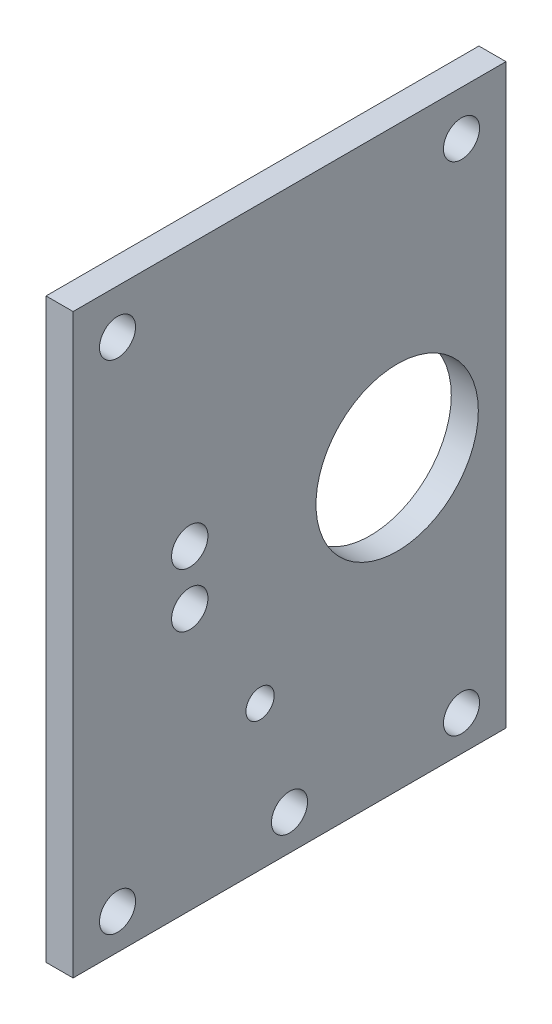
ISO-10303-21;
HEADER;
FILE_DESCRIPTION(('STEP AP214'),'2;1');
FILE_NAME('part.step','',(''),(''),'','','');
FILE_SCHEMA(('AUTOMOTIVE_DESIGN { 1 0 10303 214 1 1 1 1 }'));
ENDSEC;
DATA;
#1=APPLICATION_CONTEXT('core data for automotive mechanical design processes');
#2=APPLICATION_PROTOCOL_DEFINITION('international standard','automotive_design',2000,#1);
#3=PRODUCT_CONTEXT('',#1,'mechanical');
#4=PRODUCT('Part','Part','',(#3));
#5=PRODUCT_RELATED_PRODUCT_CATEGORY('part','',(#4));
#6=PRODUCT_DEFINITION_FORMATION('','',#4);
#7=PRODUCT_DEFINITION_CONTEXT('part definition',#1,'design');
#8=PRODUCT_DEFINITION('design','',#6,#7);
#9=PRODUCT_DEFINITION_SHAPE('','',#8);
#10=(LENGTH_UNIT() NAMED_UNIT(*) SI_UNIT(.MILLI.,.METRE.));
#11=(NAMED_UNIT(*) PLANE_ANGLE_UNIT() SI_UNIT($,.RADIAN.));
#12=(NAMED_UNIT(*) SI_UNIT($,.STERADIAN.) SOLID_ANGLE_UNIT());
#13=UNCERTAINTY_MEASURE_WITH_UNIT(LENGTH_MEASURE(1.E-05),#10,'distance_accuracy_value','');
#14=(GEOMETRIC_REPRESENTATION_CONTEXT(3) GLOBAL_UNCERTAINTY_ASSIGNED_CONTEXT((#13)) GLOBAL_UNIT_ASSIGNED_CONTEXT((#10,
#11,#12)) REPRESENTATION_CONTEXT('',''));
#15=CARTESIAN_POINT('',(0.,0.,0.));
#16=DIRECTION('',(0.,0.,1.));
#17=DIRECTION('',(1.,0.,0.));
#18=AXIS2_PLACEMENT_3D('',#15,#16,#17);
#19=CARTESIAN_POINT('',(4.7625,0.,0.));
#20=DIRECTION('',(-1.,0.,0.));
#21=DIRECTION('',(0.,0.,1.));
#22=AXIS2_PLACEMENT_3D('',#19,#20,#21);
#23=PLANE('',#22);
#24=CARTESIAN_POINT('',(4.7625,4.76250000000024,17.5641));
#25=DIRECTION('',(1.,0.,0.));
#26=DIRECTION('',(0.,0.,-1.));
#27=AXIS2_PLACEMENT_3D('',#24,#25,#26);
#28=CIRCLE('',#27,3.19999999999999);
#29=CARTESIAN_POINT('',(4.7625,4.76250000000024,14.3641));
#30=VERTEX_POINT('',#29);
#31=EDGE_CURVE('E177',#30,#30,#28,.T.);
#32=ORIENTED_EDGE('',*,*,#31,.F.);
#33=EDGE_LOOP('',(#32));
#34=FACE_BOUND('',#33,.T.);
#35=DIRECTION('',(0.,1.,0.));
#36=VECTOR('',#35,1.);
#37=CARTESIAN_POINT('',(4.7625,-50.8,-38.1));
#38=LINE('',#37,#36);
#39=CARTESIAN_POINT('',(4.7625,-50.8,-38.1));
#40=VERTEX_POINT('',#39);
#41=CARTESIAN_POINT('',(4.7625,50.8,-38.1));
#42=VERTEX_POINT('',#41);
#43=EDGE_CURVE('E86',#40,#42,#38,.T.);
#44=ORIENTED_EDGE('',*,*,#43,.T.);
#45=DIRECTION('',(0.,0.,1.));
#46=VECTOR('',#45,1.);
#47=CARTESIAN_POINT('',(4.7625,50.8,38.1));
#48=LINE('',#47,#46);
#49=CARTESIAN_POINT('',(4.7625,50.8,38.1));
#50=VERTEX_POINT('',#49);
#51=EDGE_CURVE('E81',#42,#50,#48,.T.);
#52=ORIENTED_EDGE('',*,*,#51,.T.);
#53=DIRECTION('',(0.,-1.,0.));
#54=VECTOR('',#53,1.);
#55=CARTESIAN_POINT('',(4.7625,-50.8,38.1));
#56=LINE('',#55,#54);
#57=CARTESIAN_POINT('',(4.7625,-50.8,38.1));
#58=VERTEX_POINT('',#57);
#59=EDGE_CURVE('E84',#50,#58,#56,.T.);
#60=ORIENTED_EDGE('',*,*,#59,.T.);
#61=DIRECTION('',(0.,0.,-1.));
#62=VECTOR('',#61,1.);
#63=CARTESIAN_POINT('',(4.7625,-50.8,38.1));
#64=LINE('',#63,#62);
#65=EDGE_CURVE('E51',#58,#40,#64,.T.);
#66=ORIENTED_EDGE('',*,*,#65,.T.);
#67=EDGE_LOOP('',(#44,#52,#60,#66));
#68=FACE_BOUND('',#67,.T.);
#69=CARTESIAN_POINT('',(4.7625,42.9768,-30.2768));
#70=DIRECTION('',(1.,0.,0.));
#71=DIRECTION('',(0.,0.,-1.));
#72=AXIS2_PLACEMENT_3D('',#69,#70,#71);
#73=CIRCLE('',#72,3.175);
#74=CARTESIAN_POINT('',(4.7625,42.9768,-33.4518));
#75=VERTEX_POINT('',#74);
#76=EDGE_CURVE('E110',#75,#75,#73,.T.);
#77=ORIENTED_EDGE('',*,*,#76,.F.);
#78=EDGE_LOOP('',(#77));
#79=FACE_BOUND('',#78,.T.);
#80=CARTESIAN_POINT('',(4.7625,-44.5643,-30.2768));
#81=DIRECTION('',(1.,0.,0.));
#82=DIRECTION('',(0.,0.,-1.));
#83=AXIS2_PLACEMENT_3D('',#80,#81,#82);
#84=CIRCLE('',#83,3.17499999999999);
#85=CARTESIAN_POINT('',(4.7625,-44.5643,-33.4518));
#86=VERTEX_POINT('',#85);
#87=EDGE_CURVE('E114',#86,#86,#84,.T.);
#88=ORIENTED_EDGE('',*,*,#87,.F.);
#89=EDGE_LOOP('',(#88));
#90=FACE_BOUND('',#89,.T.);
#91=CARTESIAN_POINT('',(4.7625,42.9768,30.2768));
#92=DIRECTION('',(1.,0.,0.));
#93=DIRECTION('',(0.,0.,-1.));
#94=AXIS2_PLACEMENT_3D('',#91,#92,#93);
#95=CIRCLE('',#94,3.175);
#96=CARTESIAN_POINT('',(4.7625,42.9768,27.1018));
#97=VERTEX_POINT('',#96);
#98=EDGE_CURVE('E118',#97,#97,#95,.T.);
#99=ORIENTED_EDGE('',*,*,#98,.F.);
#100=EDGE_LOOP('',(#99));
#101=FACE_BOUND('',#100,.T.);
#102=CARTESIAN_POINT('',(4.7625,-44.5643,30.2768));
#103=DIRECTION('',(1.,0.,0.));
#104=DIRECTION('',(0.,0.,-1.));
#105=AXIS2_PLACEMENT_3D('',#102,#103,#104);
#106=CIRCLE('',#105,3.175);
#107=CARTESIAN_POINT('',(4.7625,-44.5643,27.1018));
#108=VERTEX_POINT('',#107);
#109=EDGE_CURVE('E122',#108,#108,#106,.T.);
#110=ORIENTED_EDGE('',*,*,#109,.F.);
#111=EDGE_LOOP('',(#110));
#112=FACE_BOUND('',#111,.T.);
#113=CARTESIAN_POINT('',(4.7625,0.,-18.9484));
#114=DIRECTION('',(1.,0.,0.));
#115=DIRECTION('',(0.,0.,-1.));
#116=AXIS2_PLACEMENT_3D('',#113,#114,#115);
#117=CIRCLE('',#116,14.2875);
#118=CARTESIAN_POINT('',(4.7625,0.,-33.2359));
#119=VERTEX_POINT('',#118);
#120=EDGE_CURVE('E125',#119,#119,#117,.T.);
#121=ORIENTED_EDGE('',*,*,#120,.F.);
#122=EDGE_LOOP('',(#121));
#123=FACE_BOUND('',#122,.T.);
#124=CARTESIAN_POINT('',(4.7625,-25.4,5.1816));
#125=DIRECTION('',(1.,0.,0.));
#126=DIRECTION('',(0.,0.,-1.));
#127=AXIS2_PLACEMENT_3D('',#124,#125,#126);
#128=CIRCLE('',#127,2.4892);
#129=CARTESIAN_POINT('',(4.7625,-25.4,2.6924));
#130=VERTEX_POINT('',#129);
#131=EDGE_CURVE('E128',#130,#130,#128,.T.);
#132=ORIENTED_EDGE('',*,*,#131,.F.);
#133=EDGE_LOOP('',(#132));
#134=FACE_BOUND('',#133,.T.);
#135=CARTESIAN_POINT('',(4.7625,-44.5643,0.));
#136=DIRECTION('',(1.,0.,0.));
#137=DIRECTION('',(0.,0.,-1.));
#138=AXIS2_PLACEMENT_3D('',#135,#136,#137);
#139=CIRCLE('',#138,3.175);
#140=CARTESIAN_POINT('',(4.7625,-44.5643,-3.175));
#141=VERTEX_POINT('',#140);
#142=EDGE_CURVE('E138',#141,#141,#139,.T.);
#143=ORIENTED_EDGE('',*,*,#142,.F.);
#144=EDGE_LOOP('',(#143));
#145=FACE_BOUND('',#144,.T.);
#146=CARTESIAN_POINT('',(4.7625,-4.76249999999975,17.5641));
#147=DIRECTION('',(1.,0.,0.));
#148=DIRECTION('',(0.,0.,-1.));
#149=AXIS2_PLACEMENT_3D('',#146,#147,#148);
#150=CIRCLE('',#149,3.19999999999999);
#151=CARTESIAN_POINT('',(4.7625,-4.76249999999975,14.3641));
#152=VERTEX_POINT('',#151);
#153=EDGE_CURVE('E170',#152,#152,#150,.T.);
#154=ORIENTED_EDGE('',*,*,#153,.F.);
#155=EDGE_LOOP('',(#154));
#156=FACE_BOUND('',#155,.T.);
#157=ADVANCED_FACE('F32',(#34,#68,#79,#90,#101,#112,#123,#134,#145,#156),#23,.F.);
#158=CARTESIAN_POINT('',(4.7625,-50.8,-38.1));
#159=DIRECTION('',(0.,0.,1.));
#160=DIRECTION('',(1.,0.,0.));
#161=AXIS2_PLACEMENT_3D('',#158,#159,#160);
#162=PLANE('',#161);
#163=DIRECTION('',(0.,1.,0.));
#164=VECTOR('',#163,1.);
#165=CARTESIAN_POINT('',(0.,-50.8,-38.1));
#166=LINE('',#165,#164);
#167=CARTESIAN_POINT('',(0.,-50.8,-38.1));
#168=VERTEX_POINT('',#167);
#169=CARTESIAN_POINT('',(0.,50.8,-38.1));
#170=VERTEX_POINT('',#169);
#171=EDGE_CURVE('E99',#168,#170,#166,.T.);
#172=ORIENTED_EDGE('',*,*,#171,.T.);
#173=DIRECTION('',(-1.,0.,0.));
#174=VECTOR('',#173,1.);
#175=CARTESIAN_POINT('',(4.7625,50.8,-38.1));
#176=LINE('',#175,#174);
#177=EDGE_CURVE('E11',#42,#170,#176,.T.);
#178=ORIENTED_EDGE('',*,*,#177,.F.);
#179=ORIENTED_EDGE('',*,*,#43,.F.);
#180=DIRECTION('',(-1.,0.,0.));
#181=VECTOR('',#180,1.);
#182=CARTESIAN_POINT('',(4.7625,-50.8,-38.1));
#183=LINE('',#182,#181);
#184=EDGE_CURVE('E95',#40,#168,#183,.T.);
#185=ORIENTED_EDGE('',*,*,#184,.T.);
#186=EDGE_LOOP('',(#172,#178,#179,#185));
#187=FACE_BOUND('',#186,.T.);
#188=ADVANCED_FACE('F34',(#187),#162,.F.);
#189=CARTESIAN_POINT('',(4.7625,50.8,38.1));
#190=DIRECTION('',(0.,-1.,0.));
#191=DIRECTION('',(0.,0.,-1.));
#192=AXIS2_PLACEMENT_3D('',#189,#190,#191);
#193=PLANE('',#192);
#194=DIRECTION('',(0.,0.,1.));
#195=VECTOR('',#194,1.);
#196=CARTESIAN_POINT('',(0.,50.8,38.1));
#197=LINE('',#196,#195);
#198=CARTESIAN_POINT('',(0.,50.8,38.1));
#199=VERTEX_POINT('',#198);
#200=EDGE_CURVE('E90',#170,#199,#197,.T.);
#201=ORIENTED_EDGE('',*,*,#200,.T.);
#202=DIRECTION('',(-1.,0.,0.));
#203=VECTOR('',#202,1.);
#204=CARTESIAN_POINT('',(4.7625,50.8,38.1));
#205=LINE('',#204,#203);
#206=EDGE_CURVE('E42',#50,#199,#205,.T.);
#207=ORIENTED_EDGE('',*,*,#206,.F.);
#208=ORIENTED_EDGE('',*,*,#51,.F.);
#209=ORIENTED_EDGE('',*,*,#177,.T.);
#210=EDGE_LOOP('',(#201,#207,#208,#209));
#211=FACE_BOUND('',#210,.T.);
#212=ADVANCED_FACE('F89',(#211),#193,.F.);
#213=CARTESIAN_POINT('',(4.7625,-50.8,38.1));
#214=DIRECTION('',(0.,0.,-1.));
#215=DIRECTION('',(-1.,0.,0.));
#216=AXIS2_PLACEMENT_3D('',#213,#214,#215);
#217=PLANE('',#216);
#218=DIRECTION('',(0.,-1.,0.));
#219=VECTOR('',#218,1.);
#220=CARTESIAN_POINT('',(0.,-50.8,38.1));
#221=LINE('',#220,#219);
#222=CARTESIAN_POINT('',(0.,-50.8,38.1));
#223=VERTEX_POINT('',#222);
#224=EDGE_CURVE('E68',#199,#223,#221,.T.);
#225=ORIENTED_EDGE('',*,*,#224,.T.);
#226=DIRECTION('',(-1.,0.,0.));
#227=VECTOR('',#226,1.);
#228=CARTESIAN_POINT('',(4.7625,-50.8,38.1));
#229=LINE('',#228,#227);
#230=EDGE_CURVE('E91',#58,#223,#229,.T.);
#231=ORIENTED_EDGE('',*,*,#230,.F.);
#232=ORIENTED_EDGE('',*,*,#59,.F.);
#233=ORIENTED_EDGE('',*,*,#206,.T.);
#234=EDGE_LOOP('',(#225,#231,#232,#233));
#235=FACE_BOUND('',#234,.T.);
#236=ADVANCED_FACE('F93',(#235),#217,.F.);
#237=CARTESIAN_POINT('',(4.7625,-50.8,38.1));
#238=DIRECTION('',(0.,1.,0.));
#239=DIRECTION('',(0.,0.,1.));
#240=AXIS2_PLACEMENT_3D('',#237,#238,#239);
#241=PLANE('',#240);
#242=DIRECTION('',(0.,0.,-1.));
#243=VECTOR('',#242,1.);
#244=CARTESIAN_POINT('',(0.,-50.8,38.1));
#245=LINE('',#244,#243);
#246=EDGE_CURVE('E74',#223,#168,#245,.T.);
#247=ORIENTED_EDGE('',*,*,#246,.T.);
#248=ORIENTED_EDGE('',*,*,#184,.F.);
#249=ORIENTED_EDGE('',*,*,#65,.F.);
#250=ORIENTED_EDGE('',*,*,#230,.T.);
#251=EDGE_LOOP('',(#247,#248,#249,#250));
#252=FACE_BOUND('',#251,.T.);
#253=ADVANCED_FACE('F193',(#252),#241,.F.);
#254=CARTESIAN_POINT('',(0.,0.,0.));
#255=DIRECTION('',(-1.,0.,0.));
#256=DIRECTION('',(0.,0.,1.));
#257=AXIS2_PLACEMENT_3D('',#254,#255,#256);
#258=PLANE('',#257);
#259=CARTESIAN_POINT('',(0.,4.76250000000024,17.5641));
#260=DIRECTION('',(-1.,0.,0.));
#261=DIRECTION('',(0.,0.,1.));
#262=AXIS2_PLACEMENT_3D('',#259,#260,#261);
#263=CIRCLE('',#262,3.19999999999999);
#264=CARTESIAN_POINT('',(0.,4.76250000000024,20.7640999999999));
#265=VERTEX_POINT('',#264);
#266=EDGE_CURVE('E173',#265,#265,#263,.T.);
#267=ORIENTED_EDGE('',*,*,#266,.F.);
#268=EDGE_LOOP('',(#267));
#269=FACE_BOUND('',#268,.T.);
#270=CARTESIAN_POINT('',(0.,-4.76249999999975,17.5641));
#271=DIRECTION('',(-1.,0.,0.));
#272=DIRECTION('',(0.,0.,1.));
#273=AXIS2_PLACEMENT_3D('',#270,#271,#272);
#274=CIRCLE('',#273,3.19999999999999);
#275=CARTESIAN_POINT('',(0.,-4.76249999999975,20.7641));
#276=VERTEX_POINT('',#275);
#277=EDGE_CURVE('E172',#276,#276,#274,.T.);
#278=ORIENTED_EDGE('',*,*,#277,.F.);
#279=EDGE_LOOP('',(#278));
#280=FACE_BOUND('',#279,.T.);
#281=CARTESIAN_POINT('',(0.,-44.5643,0.));
#282=DIRECTION('',(-1.,0.,0.));
#283=DIRECTION('',(0.,0.,1.));
#284=AXIS2_PLACEMENT_3D('',#281,#282,#283);
#285=CIRCLE('',#284,3.175);
#286=CARTESIAN_POINT('',(0.,-44.5643,3.175));
#287=VERTEX_POINT('',#286);
#288=EDGE_CURVE('E36',#287,#287,#285,.T.);
#289=ORIENTED_EDGE('',*,*,#288,.F.);
#290=EDGE_LOOP('',(#289));
#291=FACE_BOUND('',#290,.T.);
#292=CARTESIAN_POINT('',(0.,-25.4,5.1816));
#293=DIRECTION('',(-1.,0.,0.));
#294=DIRECTION('',(0.,0.,1.));
#295=AXIS2_PLACEMENT_3D('',#292,#293,#294);
#296=CIRCLE('',#295,2.4892);
#297=CARTESIAN_POINT('',(0.,-25.4,7.6708));
#298=VERTEX_POINT('',#297);
#299=EDGE_CURVE('E126',#298,#298,#296,.T.);
#300=ORIENTED_EDGE('',*,*,#299,.F.);
#301=EDGE_LOOP('',(#300));
#302=FACE_BOUND('',#301,.T.);
#303=CARTESIAN_POINT('',(0.,0.,-18.9484));
#304=DIRECTION('',(-1.,0.,0.));
#305=DIRECTION('',(0.,0.,1.));
#306=AXIS2_PLACEMENT_3D('',#303,#304,#305);
#307=CIRCLE('',#306,14.2875);
#308=CARTESIAN_POINT('',(0.,0.,-4.66089999999999));
#309=VERTEX_POINT('',#308);
#310=EDGE_CURVE('E123',#309,#309,#307,.T.);
#311=ORIENTED_EDGE('',*,*,#310,.F.);
#312=EDGE_LOOP('',(#311));
#313=FACE_BOUND('',#312,.T.);
#314=CARTESIAN_POINT('',(0.,-44.5643,30.2768));
#315=DIRECTION('',(-1.,0.,0.));
#316=DIRECTION('',(0.,0.,1.));
#317=AXIS2_PLACEMENT_3D('',#314,#315,#316);
#318=CIRCLE('',#317,3.175);
#319=CARTESIAN_POINT('',(0.,-44.5643,33.4518));
#320=VERTEX_POINT('',#319);
#321=EDGE_CURVE('E119',#320,#320,#318,.T.);
#322=ORIENTED_EDGE('',*,*,#321,.F.);
#323=EDGE_LOOP('',(#322));
#324=FACE_BOUND('',#323,.T.);
#325=CARTESIAN_POINT('',(0.,42.9768,30.2768));
#326=DIRECTION('',(-1.,0.,0.));
#327=DIRECTION('',(0.,0.,1.));
#328=AXIS2_PLACEMENT_3D('',#325,#326,#327);
#329=CIRCLE('',#328,3.175);
#330=CARTESIAN_POINT('',(0.,42.9768,33.4518));
#331=VERTEX_POINT('',#330);
#332=EDGE_CURVE('E115',#331,#331,#329,.T.);
#333=ORIENTED_EDGE('',*,*,#332,.F.);
#334=EDGE_LOOP('',(#333));
#335=FACE_BOUND('',#334,.T.);
#336=CARTESIAN_POINT('',(0.,-44.5643,-30.2768));
#337=DIRECTION('',(-1.,0.,0.));
#338=DIRECTION('',(0.,0.,1.));
#339=AXIS2_PLACEMENT_3D('',#336,#337,#338);
#340=CIRCLE('',#339,3.17499999999999);
#341=CARTESIAN_POINT('',(0.,-44.5643,-27.1018));
#342=VERTEX_POINT('',#341);
#343=EDGE_CURVE('E111',#342,#342,#340,.T.);
#344=ORIENTED_EDGE('',*,*,#343,.F.);
#345=EDGE_LOOP('',(#344));
#346=FACE_BOUND('',#345,.T.);
#347=CARTESIAN_POINT('',(0.,42.9768,-30.2768));
#348=DIRECTION('',(-1.,0.,0.));
#349=DIRECTION('',(0.,0.,1.));
#350=AXIS2_PLACEMENT_3D('',#347,#348,#349);
#351=CIRCLE('',#350,3.175);
#352=CARTESIAN_POINT('',(0.,42.9768,-27.1018));
#353=VERTEX_POINT('',#352);
#354=EDGE_CURVE('E102',#353,#353,#351,.T.);
#355=ORIENTED_EDGE('',*,*,#354,.F.);
#356=EDGE_LOOP('',(#355));
#357=FACE_BOUND('',#356,.T.);
#358=ORIENTED_EDGE('',*,*,#171,.F.);
#359=ORIENTED_EDGE('',*,*,#246,.F.);
#360=ORIENTED_EDGE('',*,*,#224,.F.);
#361=ORIENTED_EDGE('',*,*,#200,.F.);
#362=EDGE_LOOP('',(#358,#359,#360,#361));
#363=FACE_BOUND('',#362,.T.);
#364=ADVANCED_FACE('F190',(#269,#280,#291,#302,#313,#324,#335,#346,#357,#363),#258,.T.);
#365=CARTESIAN_POINT('',(-1.5875,42.9768,-30.2768));
#366=DIRECTION('',(1.,0.,0.));
#367=DIRECTION('',(0.,0.,-1.));
#368=AXIS2_PLACEMENT_3D('',#365,#366,#367);
#369=CYLINDRICAL_SURFACE('',#368,3.175);
#370=ORIENTED_EDGE('',*,*,#354,.T.);
#371=EDGE_LOOP('',(#370));
#372=FACE_BOUND('',#371,.T.);
#373=ORIENTED_EDGE('',*,*,#76,.T.);
#374=EDGE_LOOP('',(#373));
#375=FACE_BOUND('',#374,.T.);
#376=ADVANCED_FACE('F151',(#372,#375),#369,.F.);
#377=CARTESIAN_POINT('',(-1.5875,-44.5643,-30.2768));
#378=DIRECTION('',(1.,0.,0.));
#379=DIRECTION('',(0.,0.,-1.));
#380=AXIS2_PLACEMENT_3D('',#377,#378,#379);
#381=CYLINDRICAL_SURFACE('',#380,3.17499999999999);
#382=ORIENTED_EDGE('',*,*,#343,.T.);
#383=EDGE_LOOP('',(#382));
#384=FACE_BOUND('',#383,.T.);
#385=ORIENTED_EDGE('',*,*,#87,.T.);
#386=EDGE_LOOP('',(#385));
#387=FACE_BOUND('',#386,.T.);
#388=ADVANCED_FACE('F291',(#384,#387),#381,.F.);
#389=CARTESIAN_POINT('',(-1.5875,42.9768,30.2768));
#390=DIRECTION('',(1.,0.,0.));
#391=DIRECTION('',(0.,0.,-1.));
#392=AXIS2_PLACEMENT_3D('',#389,#390,#391);
#393=CYLINDRICAL_SURFACE('',#392,3.175);
#394=ORIENTED_EDGE('',*,*,#332,.T.);
#395=EDGE_LOOP('',(#394));
#396=FACE_BOUND('',#395,.T.);
#397=ORIENTED_EDGE('',*,*,#98,.T.);
#398=EDGE_LOOP('',(#397));
#399=FACE_BOUND('',#398,.T.);
#400=ADVANCED_FACE('F283',(#396,#399),#393,.F.);
#401=CARTESIAN_POINT('',(-1.5875,-44.5643,30.2768));
#402=DIRECTION('',(1.,0.,0.));
#403=DIRECTION('',(0.,0.,-1.));
#404=AXIS2_PLACEMENT_3D('',#401,#402,#403);
#405=CYLINDRICAL_SURFACE('',#404,3.175);
#406=ORIENTED_EDGE('',*,*,#321,.T.);
#407=EDGE_LOOP('',(#406));
#408=FACE_BOUND('',#407,.T.);
#409=ORIENTED_EDGE('',*,*,#109,.T.);
#410=EDGE_LOOP('',(#409));
#411=FACE_BOUND('',#410,.T.);
#412=ADVANCED_FACE('F275',(#408,#411),#405,.F.);
#413=CARTESIAN_POINT('',(-1.5875,0.,-18.9484));
#414=DIRECTION('',(1.,0.,0.));
#415=DIRECTION('',(0.,0.,-1.));
#416=AXIS2_PLACEMENT_3D('',#413,#414,#415);
#417=CYLINDRICAL_SURFACE('',#416,14.2875);
#418=ORIENTED_EDGE('',*,*,#310,.T.);
#419=EDGE_LOOP('',(#418));
#420=FACE_BOUND('',#419,.T.);
#421=ORIENTED_EDGE('',*,*,#120,.T.);
#422=EDGE_LOOP('',(#421));
#423=FACE_BOUND('',#422,.T.);
#424=ADVANCED_FACE('F268',(#420,#423),#417,.F.);
#425=CARTESIAN_POINT('',(-1.5875,-25.4,5.1816));
#426=DIRECTION('',(1.,0.,0.));
#427=DIRECTION('',(0.,0.,-1.));
#428=AXIS2_PLACEMENT_3D('',#425,#426,#427);
#429=CYLINDRICAL_SURFACE('',#428,2.4892);
#430=ORIENTED_EDGE('',*,*,#299,.T.);
#431=EDGE_LOOP('',(#430));
#432=FACE_BOUND('',#431,.T.);
#433=ORIENTED_EDGE('',*,*,#131,.T.);
#434=EDGE_LOOP('',(#433));
#435=FACE_BOUND('',#434,.T.);
#436=ADVANCED_FACE('F263',(#432,#435),#429,.F.);
#437=CARTESIAN_POINT('',(-1.5875,-44.5643,0.));
#438=DIRECTION('',(1.,0.,0.));
#439=DIRECTION('',(0.,0.,-1.));
#440=AXIS2_PLACEMENT_3D('',#437,#438,#439);
#441=CYLINDRICAL_SURFACE('',#440,3.175);
#442=ORIENTED_EDGE('',*,*,#288,.T.);
#443=EDGE_LOOP('',(#442));
#444=FACE_BOUND('',#443,.T.);
#445=ORIENTED_EDGE('',*,*,#142,.T.);
#446=EDGE_LOOP('',(#445));
#447=FACE_BOUND('',#446,.T.);
#448=ADVANCED_FACE('F236',(#444,#447),#441,.F.);
#449=CARTESIAN_POINT('',(4.7625,-4.76249999999975,17.5641));
#450=DIRECTION('',(1.,0.,0.));
#451=DIRECTION('',(0.,0.,-1.));
#452=AXIS2_PLACEMENT_3D('',#449,#450,#451);
#453=CYLINDRICAL_SURFACE('',#452,3.19999999999999);
#454=ORIENTED_EDGE('',*,*,#153,.T.);
#455=EDGE_LOOP('',(#454));
#456=FACE_BOUND('',#455,.T.);
#457=ORIENTED_EDGE('',*,*,#277,.T.);
#458=EDGE_LOOP('',(#457));
#459=FACE_BOUND('',#458,.T.);
#460=ADVANCED_FACE('F186',(#456,#459),#453,.F.);
#461=CARTESIAN_POINT('',(4.7625,4.76250000000024,17.5641));
#462=DIRECTION('',(1.,0.,0.));
#463=DIRECTION('',(0.,0.,-1.));
#464=AXIS2_PLACEMENT_3D('',#461,#462,#463);
#465=CYLINDRICAL_SURFACE('',#464,3.19999999999999);
#466=ORIENTED_EDGE('',*,*,#31,.T.);
#467=EDGE_LOOP('',(#466));
#468=FACE_BOUND('',#467,.T.);
#469=ORIENTED_EDGE('',*,*,#266,.T.);
#470=EDGE_LOOP('',(#469));
#471=FACE_BOUND('',#470,.T.);
#472=ADVANCED_FACE('F183',(#468,#471),#465,.F.);
#473=CLOSED_SHELL('',(#157,#188,#212,#236,#253,#364,#376,#388,#400,#412,#424,#436,#448,#460,#472));
#474=MANIFOLD_SOLID_BREP('B2',#473);
#475=ADVANCED_BREP_SHAPE_REPRESENTATION('',(#18,#474),#14);
#476=SHAPE_DEFINITION_REPRESENTATION(#9,#475);
ENDSEC;
END-ISO-10303-21;
